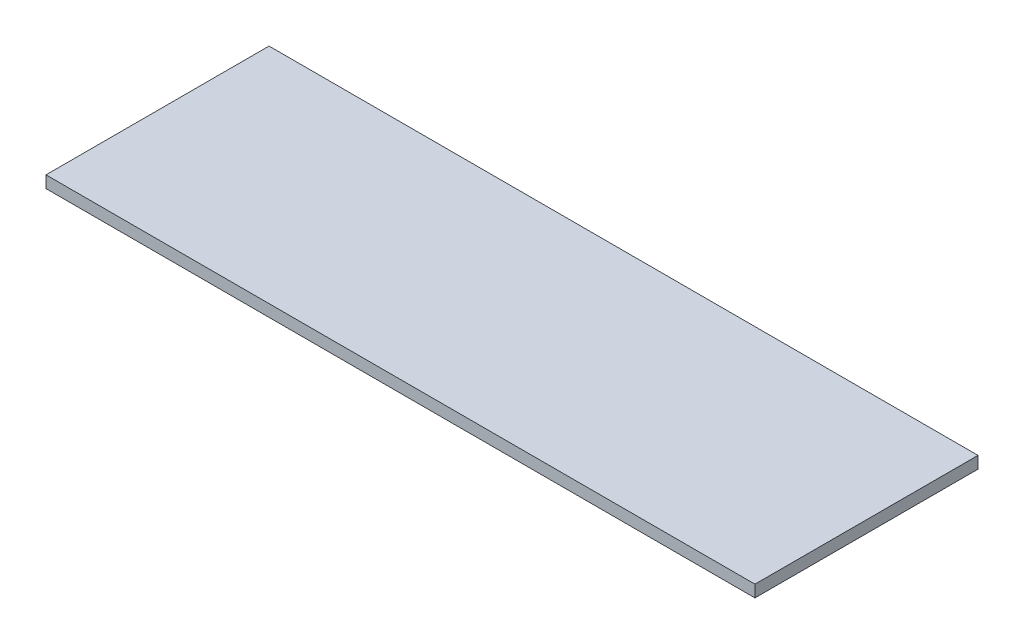
ISO-10303-21;
HEADER;
FILE_DESCRIPTION(('STEP AP214'),'2;1');
FILE_NAME('part.step','',(''),(''),'','','');
FILE_SCHEMA(('AUTOMOTIVE_DESIGN { 1 0 10303 214 1 1 1 1 }'));
ENDSEC;
DATA;
#1=APPLICATION_CONTEXT('core data for automotive mechanical design processes');
#2=APPLICATION_PROTOCOL_DEFINITION('international standard','automotive_design',2000,#1);
#3=PRODUCT_CONTEXT('',#1,'mechanical');
#4=PRODUCT('Part','Part','',(#3));
#5=PRODUCT_RELATED_PRODUCT_CATEGORY('part','',(#4));
#6=PRODUCT_DEFINITION_FORMATION('','',#4);
#7=PRODUCT_DEFINITION_CONTEXT('part definition',#1,'design');
#8=PRODUCT_DEFINITION('design','',#6,#7);
#9=PRODUCT_DEFINITION_SHAPE('','',#8);
#10=(LENGTH_UNIT() NAMED_UNIT(*) SI_UNIT(.MILLI.,.METRE.));
#11=(NAMED_UNIT(*) PLANE_ANGLE_UNIT() SI_UNIT($,.RADIAN.));
#12=(NAMED_UNIT(*) SI_UNIT($,.STERADIAN.) SOLID_ANGLE_UNIT());
#13=UNCERTAINTY_MEASURE_WITH_UNIT(LENGTH_MEASURE(1.E-05),#10,'distance_accuracy_value','');
#14=(GEOMETRIC_REPRESENTATION_CONTEXT(3) GLOBAL_UNCERTAINTY_ASSIGNED_CONTEXT((#13)) GLOBAL_UNIT_ASSIGNED_CONTEXT((#10,
#11,#12)) REPRESENTATION_CONTEXT('',''));
#15=CARTESIAN_POINT('',(0.,0.,0.));
#16=DIRECTION('',(0.,0.,1.));
#17=DIRECTION('',(1.,0.,0.));
#18=AXIS2_PLACEMENT_3D('',#15,#16,#17);
#19=CARTESIAN_POINT('',(89.,3.,-28.));
#20=DIRECTION('',(-1.,0.,0.));
#21=DIRECTION('',(0.,0.,1.));
#22=AXIS2_PLACEMENT_3D('',#19,#20,#21);
#23=PLANE('',#22);
#24=DIRECTION('',(0.,0.,-1.));
#25=VECTOR('',#24,1.);
#26=CARTESIAN_POINT('',(89.,0.,-28.));
#27=LINE('',#26,#25);
#28=CARTESIAN_POINT('',(89.,0.,28.));
#29=VERTEX_POINT('',#28);
#30=CARTESIAN_POINT('',(89.,0.,-28.));
#31=VERTEX_POINT('',#30);
#32=EDGE_CURVE('E98',#29,#31,#27,.T.);
#33=ORIENTED_EDGE('',*,*,#32,.T.);
#34=DIRECTION('',(0.,-1.,0.));
#35=VECTOR('',#34,1.);
#36=CARTESIAN_POINT('',(89.,3.,-28.));
#37=LINE('',#36,#35);
#38=CARTESIAN_POINT('',(89.,3.,-28.));
#39=VERTEX_POINT('',#38);
#40=EDGE_CURVE('E11',#39,#31,#37,.T.);
#41=ORIENTED_EDGE('',*,*,#40,.F.);
#42=DIRECTION('',(0.,0.,-1.));
#43=VECTOR('',#42,1.);
#44=CARTESIAN_POINT('',(89.,3.,-28.));
#45=LINE('',#44,#43);
#46=CARTESIAN_POINT('',(89.,3.,28.));
#47=VERTEX_POINT('',#46);
#48=EDGE_CURVE('E86',#47,#39,#45,.T.);
#49=ORIENTED_EDGE('',*,*,#48,.F.);
#50=DIRECTION('',(0.,-1.,0.));
#51=VECTOR('',#50,1.);
#52=CARTESIAN_POINT('',(89.,3.,28.));
#53=LINE('',#52,#51);
#54=EDGE_CURVE('E94',#47,#29,#53,.T.);
#55=ORIENTED_EDGE('',*,*,#54,.T.);
#56=EDGE_LOOP('',(#33,#41,#49,#55));
#57=FACE_BOUND('',#56,.T.);
#58=ADVANCED_FACE('F35',(#57),#23,.F.);
#59=CARTESIAN_POINT('',(-89.,3.,-28.));
#60=DIRECTION('',(0.,0.,1.));
#61=DIRECTION('',(1.,0.,0.));
#62=AXIS2_PLACEMENT_3D('',#59,#60,#61);
#63=PLANE('',#62);
#64=DIRECTION('',(-1.,0.,0.));
#65=VECTOR('',#64,1.);
#66=CARTESIAN_POINT('',(-89.,0.,-28.));
#67=LINE('',#66,#65);
#68=CARTESIAN_POINT('',(-89.,0.,-28.));
#69=VERTEX_POINT('',#68);
#70=EDGE_CURVE('E90',#31,#69,#67,.T.);
#71=ORIENTED_EDGE('',*,*,#70,.T.);
#72=DIRECTION('',(0.,-1.,0.));
#73=VECTOR('',#72,1.);
#74=CARTESIAN_POINT('',(-89.,3.,-28.));
#75=LINE('',#74,#73);
#76=CARTESIAN_POINT('',(-89.,3.,-28.));
#77=VERTEX_POINT('',#76);
#78=EDGE_CURVE('E43',#77,#69,#75,.T.);
#79=ORIENTED_EDGE('',*,*,#78,.F.);
#80=DIRECTION('',(-1.,0.,0.));
#81=VECTOR('',#80,1.);
#82=CARTESIAN_POINT('',(-89.,3.,-28.));
#83=LINE('',#82,#81);
#84=EDGE_CURVE('E81',#39,#77,#83,.T.);
#85=ORIENTED_EDGE('',*,*,#84,.F.);
#86=ORIENTED_EDGE('',*,*,#40,.T.);
#87=EDGE_LOOP('',(#71,#79,#85,#86));
#88=FACE_BOUND('',#87,.T.);
#89=ADVANCED_FACE('F89',(#88),#63,.F.);
#90=CARTESIAN_POINT('',(-89.,3.,-28.));
#91=DIRECTION('',(1.,0.,0.));
#92=DIRECTION('',(0.,0.,-1.));
#93=AXIS2_PLACEMENT_3D('',#90,#91,#92);
#94=PLANE('',#93);
#95=DIRECTION('',(0.,0.,1.));
#96=VECTOR('',#95,1.);
#97=CARTESIAN_POINT('',(-89.,0.,-28.));
#98=LINE('',#97,#96);
#99=CARTESIAN_POINT('',(-89.,0.,28.));
#100=VERTEX_POINT('',#99);
#101=EDGE_CURVE('E68',#69,#100,#98,.T.);
#102=ORIENTED_EDGE('',*,*,#101,.T.);
#103=DIRECTION('',(0.,-1.,0.));
#104=VECTOR('',#103,1.);
#105=CARTESIAN_POINT('',(-89.,3.,28.));
#106=LINE('',#105,#104);
#107=CARTESIAN_POINT('',(-89.,3.,28.));
#108=VERTEX_POINT('',#107);
#109=EDGE_CURVE('E91',#108,#100,#106,.T.);
#110=ORIENTED_EDGE('',*,*,#109,.F.);
#111=DIRECTION('',(0.,0.,1.));
#112=VECTOR('',#111,1.);
#113=CARTESIAN_POINT('',(-89.,3.,-28.));
#114=LINE('',#113,#112);
#115=EDGE_CURVE('E84',#77,#108,#114,.T.);
#116=ORIENTED_EDGE('',*,*,#115,.F.);
#117=ORIENTED_EDGE('',*,*,#78,.T.);
#118=EDGE_LOOP('',(#102,#110,#116,#117));
#119=FACE_BOUND('',#118,.T.);
#120=ADVANCED_FACE('F92',(#119),#94,.F.);
#121=CARTESIAN_POINT('',(-89.,3.,28.));
#122=DIRECTION('',(0.,0.,-1.));
#123=DIRECTION('',(-1.,0.,0.));
#124=AXIS2_PLACEMENT_3D('',#121,#122,#123);
#125=PLANE('',#124);
#126=DIRECTION('',(1.,0.,0.));
#127=VECTOR('',#126,1.);
#128=CARTESIAN_POINT('',(-89.,0.,28.));
#129=LINE('',#128,#127);
#130=EDGE_CURVE('E74',#100,#29,#129,.T.);
#131=ORIENTED_EDGE('',*,*,#130,.T.);
#132=ORIENTED_EDGE('',*,*,#54,.F.);
#133=DIRECTION('',(1.,0.,0.));
#134=VECTOR('',#133,1.);
#135=CARTESIAN_POINT('',(-89.,3.,28.));
#136=LINE('',#135,#134);
#137=EDGE_CURVE('E51',#108,#47,#136,.T.);
#138=ORIENTED_EDGE('',*,*,#137,.F.);
#139=ORIENTED_EDGE('',*,*,#109,.T.);
#140=EDGE_LOOP('',(#131,#132,#138,#139));
#141=FACE_BOUND('',#140,.T.);
#142=ADVANCED_FACE('F105',(#141),#125,.F.);
#143=CARTESIAN_POINT('',(0.,3.,0.));
#144=DIRECTION('',(0.,1.,0.));
#145=DIRECTION('',(0.,0.,1.));
#146=AXIS2_PLACEMENT_3D('',#143,#144,#145);
#147=PLANE('',#146);
#148=ORIENTED_EDGE('',*,*,#48,.T.);
#149=ORIENTED_EDGE('',*,*,#84,.T.);
#150=ORIENTED_EDGE('',*,*,#115,.T.);
#151=ORIENTED_EDGE('',*,*,#137,.T.);
#152=EDGE_LOOP('',(#148,#149,#150,#151));
#153=FACE_BOUND('',#152,.T.);
#154=ADVANCED_FACE('F82',(#153),#147,.T.);
#155=CARTESIAN_POINT('',(0.,0.,0.));
#156=DIRECTION('',(0.,1.,0.));
#157=DIRECTION('',(0.,0.,1.));
#158=AXIS2_PLACEMENT_3D('',#155,#156,#157);
#159=PLANE('',#158);
#160=ORIENTED_EDGE('',*,*,#32,.F.);
#161=ORIENTED_EDGE('',*,*,#130,.F.);
#162=ORIENTED_EDGE('',*,*,#101,.F.);
#163=ORIENTED_EDGE('',*,*,#70,.F.);
#164=EDGE_LOOP('',(#160,#161,#162,#163));
#165=FACE_BOUND('',#164,.T.);
#166=ADVANCED_FACE('F108',(#165),#159,.F.);
#167=CLOSED_SHELL('',(#58,#89,#120,#142,#154,#166));
#168=MANIFOLD_SOLID_BREP('B2',#167);
#169=ADVANCED_BREP_SHAPE_REPRESENTATION('',(#18,#168),#14);
#170=SHAPE_DEFINITION_REPRESENTATION(#9,#169);
ENDSEC;
END-ISO-10303-21;
